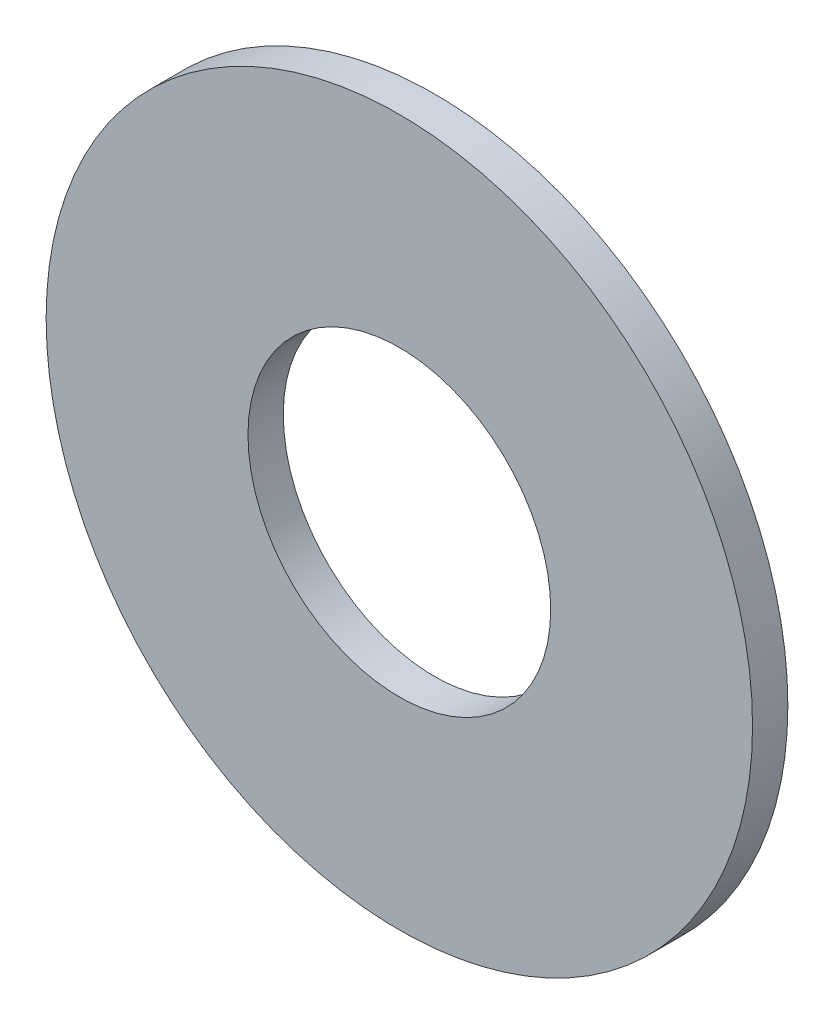
ISO-10303-21;
HEADER;
FILE_DESCRIPTION(('STEP AP214'),'2;1');
FILE_NAME('part.step','',(''),(''),'','','');
FILE_SCHEMA(('AUTOMOTIVE_DESIGN { 1 0 10303 214 1 1 1 1 }'));
ENDSEC;
DATA;
#1=APPLICATION_CONTEXT('core data for automotive mechanical design processes');
#2=APPLICATION_PROTOCOL_DEFINITION('international standard','automotive_design',2000,#1);
#3=PRODUCT_CONTEXT('',#1,'mechanical');
#4=PRODUCT('Part','Part','',(#3));
#5=PRODUCT_RELATED_PRODUCT_CATEGORY('part','',(#4));
#6=PRODUCT_DEFINITION_FORMATION('','',#4);
#7=PRODUCT_DEFINITION_CONTEXT('part definition',#1,'design');
#8=PRODUCT_DEFINITION('design','',#6,#7);
#9=PRODUCT_DEFINITION_SHAPE('','',#8);
#10=(LENGTH_UNIT() NAMED_UNIT(*) SI_UNIT(.MILLI.,.METRE.));
#11=(NAMED_UNIT(*) PLANE_ANGLE_UNIT() SI_UNIT($,.RADIAN.));
#12=(NAMED_UNIT(*) SI_UNIT($,.STERADIAN.) SOLID_ANGLE_UNIT());
#13=UNCERTAINTY_MEASURE_WITH_UNIT(LENGTH_MEASURE(1.E-05),#10,'distance_accuracy_value','');
#14=(GEOMETRIC_REPRESENTATION_CONTEXT(3) GLOBAL_UNCERTAINTY_ASSIGNED_CONTEXT((#13)) GLOBAL_UNIT_ASSIGNED_CONTEXT((#10,
#11,#12)) REPRESENTATION_CONTEXT('',''));
#15=CARTESIAN_POINT('',(0.,0.,0.));
#16=DIRECTION('',(0.,0.,1.));
#17=DIRECTION('',(1.,0.,0.));
#18=AXIS2_PLACEMENT_3D('',#15,#16,#17);
#19=CARTESIAN_POINT('',(45.,0.,1.4));
#20=DIRECTION('',(0.,0.,1.));
#21=DIRECTION('',(1.,0.,0.));
#22=AXIS2_PLACEMENT_3D('',#19,#20,#21);
#23=PLANE('',#22);
#24=CARTESIAN_POINT('',(45.,0.,1.4));
#25=DIRECTION('',(0.,0.,1.));
#26=DIRECTION('',(1.,0.,0.));
#27=AXIS2_PLACEMENT_3D('',#24,#25,#26);
#28=CIRCLE('',#27,14.);
#29=CARTESIAN_POINT('',(59.,0.,1.4));
#30=VERTEX_POINT('',#29);
#31=EDGE_CURVE('E10',#30,#30,#28,.T.);
#32=ORIENTED_EDGE('',*,*,#31,.T.);
#33=EDGE_LOOP('',(#32));
#34=FACE_BOUND('',#33,.T.);
#35=CARTESIAN_POINT('',(45.,0.,1.4));
#36=DIRECTION('',(0.,0.,1.));
#37=DIRECTION('',(1.,0.,0.));
#38=AXIS2_PLACEMENT_3D('',#35,#36,#37);
#39=CIRCLE('',#38,6.);
#40=CARTESIAN_POINT('',(51.,0.,1.4));
#41=VERTEX_POINT('',#40);
#42=EDGE_CURVE('E42',#41,#41,#39,.T.);
#43=ORIENTED_EDGE('',*,*,#42,.F.);
#44=EDGE_LOOP('',(#43));
#45=FACE_BOUND('',#44,.T.);
#46=ADVANCED_FACE('F31',(#34,#45),#23,.T.);
#47=CARTESIAN_POINT('',(45.,0.,0.));
#48=DIRECTION('',(0.,0.,1.));
#49=DIRECTION('',(1.,0.,0.));
#50=AXIS2_PLACEMENT_3D('',#47,#48,#49);
#51=PLANE('',#50);
#52=CARTESIAN_POINT('',(45.,0.,0.));
#53=DIRECTION('',(0.,0.,1.));
#54=DIRECTION('',(1.,0.,0.));
#55=AXIS2_PLACEMENT_3D('',#52,#53,#54);
#56=CIRCLE('',#55,14.);
#57=CARTESIAN_POINT('',(59.,0.,0.));
#58=VERTEX_POINT('',#57);
#59=EDGE_CURVE('E38',#58,#58,#56,.T.);
#60=ORIENTED_EDGE('',*,*,#59,.F.);
#61=EDGE_LOOP('',(#60));
#62=FACE_BOUND('',#61,.T.);
#63=CARTESIAN_POINT('',(45.,0.,0.));
#64=DIRECTION('',(0.,0.,1.));
#65=DIRECTION('',(1.,0.,0.));
#66=AXIS2_PLACEMENT_3D('',#63,#64,#65);
#67=CIRCLE('',#66,6.);
#68=CARTESIAN_POINT('',(51.,0.,0.));
#69=VERTEX_POINT('',#68);
#70=EDGE_CURVE('E46',#69,#69,#67,.T.);
#71=ORIENTED_EDGE('',*,*,#70,.T.);
#72=EDGE_LOOP('',(#71));
#73=FACE_BOUND('',#72,.T.);
#74=ADVANCED_FACE('F52',(#62,#73),#51,.F.);
#75=CARTESIAN_POINT('',(45.,0.,1.4));
#76=DIRECTION('',(0.,0.,-1.));
#77=DIRECTION('',(-1.,0.,0.));
#78=AXIS2_PLACEMENT_3D('',#75,#76,#77);
#79=CYLINDRICAL_SURFACE('',#78,14.);
#80=ORIENTED_EDGE('',*,*,#31,.F.);
#81=EDGE_LOOP('',(#80));
#82=FACE_BOUND('',#81,.T.);
#83=ORIENTED_EDGE('',*,*,#59,.T.);
#84=EDGE_LOOP('',(#83));
#85=FACE_BOUND('',#84,.T.);
#86=ADVANCED_FACE('F33',(#82,#85),#79,.T.);
#87=CARTESIAN_POINT('',(45.,0.,1.4));
#88=DIRECTION('',(0.,0.,-1.));
#89=DIRECTION('',(-1.,0.,0.));
#90=AXIS2_PLACEMENT_3D('',#87,#88,#89);
#91=CYLINDRICAL_SURFACE('',#90,6.);
#92=ORIENTED_EDGE('',*,*,#42,.T.);
#93=EDGE_LOOP('',(#92));
#94=FACE_BOUND('',#93,.T.);
#95=ORIENTED_EDGE('',*,*,#70,.F.);
#96=EDGE_LOOP('',(#95));
#97=FACE_BOUND('',#96,.T.);
#98=ADVANCED_FACE('F54',(#94,#97),#91,.F.);
#99=CLOSED_SHELL('',(#46,#74,#86,#98));
#100=MANIFOLD_SOLID_BREP('B2',#99);
#101=ADVANCED_BREP_SHAPE_REPRESENTATION('',(#18,#100),#14);
#102=SHAPE_DEFINITION_REPRESENTATION(#9,#101);
ENDSEC;
END-ISO-10303-21;
